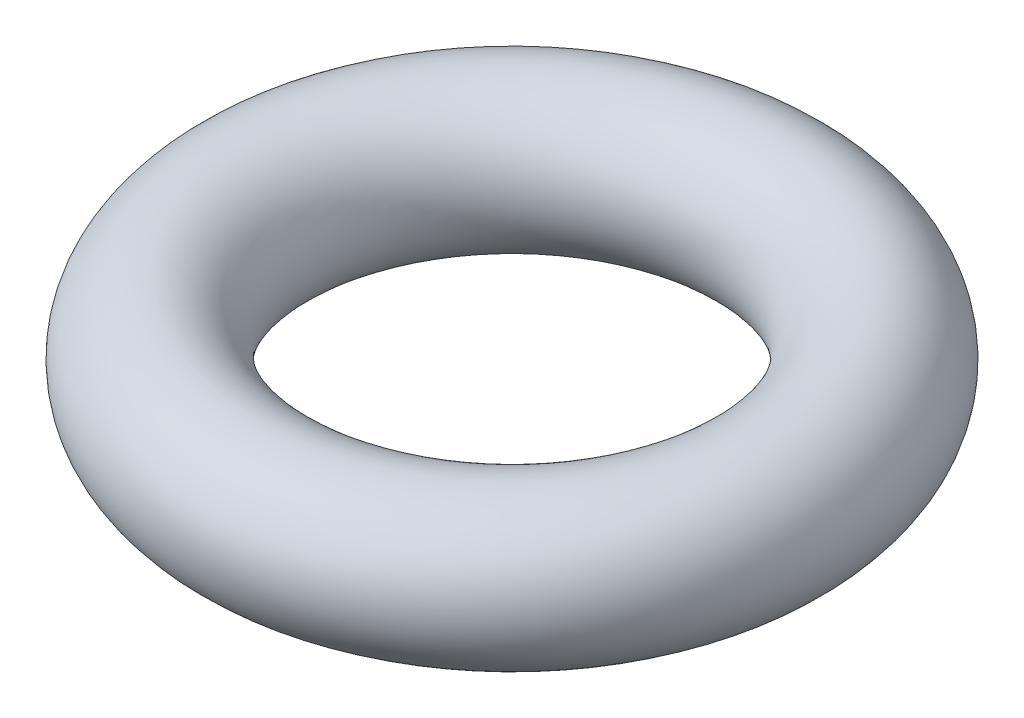
ISO-10303-21;
HEADER;
FILE_DESCRIPTION(('STEP AP214'),'2;1');
FILE_NAME('part.step','',(''),(''),'','','');
FILE_SCHEMA(('AUTOMOTIVE_DESIGN { 1 0 10303 214 1 1 1 1 }'));
ENDSEC;
DATA;
#1=APPLICATION_CONTEXT('core data for automotive mechanical design processes');
#2=APPLICATION_PROTOCOL_DEFINITION('international standard','automotive_design',2000,#1);
#3=PRODUCT_CONTEXT('',#1,'mechanical');
#4=PRODUCT('Part','Part','',(#3));
#5=PRODUCT_RELATED_PRODUCT_CATEGORY('part','',(#4));
#6=PRODUCT_DEFINITION_FORMATION('','',#4);
#7=PRODUCT_DEFINITION_CONTEXT('part definition',#1,'design');
#8=PRODUCT_DEFINITION('design','',#6,#7);
#9=PRODUCT_DEFINITION_SHAPE('','',#8);
#10=(LENGTH_UNIT() NAMED_UNIT(*) SI_UNIT(.MILLI.,.METRE.));
#11=(NAMED_UNIT(*) PLANE_ANGLE_UNIT() SI_UNIT($,.RADIAN.));
#12=(NAMED_UNIT(*) SI_UNIT($,.STERADIAN.) SOLID_ANGLE_UNIT());
#13=UNCERTAINTY_MEASURE_WITH_UNIT(LENGTH_MEASURE(1.E-05),#10,'distance_accuracy_value','');
#14=(GEOMETRIC_REPRESENTATION_CONTEXT(3) GLOBAL_UNCERTAINTY_ASSIGNED_CONTEXT((#13)) GLOBAL_UNIT_ASSIGNED_CONTEXT((#10,
#11,#12)) REPRESENTATION_CONTEXT('',''));
#15=CARTESIAN_POINT('',(0.,0.,0.));
#16=DIRECTION('',(0.,0.,1.));
#17=DIRECTION('',(1.,0.,0.));
#18=AXIS2_PLACEMENT_3D('',#15,#16,#17);
#19=CARTESIAN_POINT('',(0.,0.,0.));
#20=DIRECTION('',(0.,1.,0.));
#21=DIRECTION('',(0.,0.,1.));
#22=AXIS2_PLACEMENT_3D('',#19,#20,#21);
#23=TOROIDAL_SURFACE('',#22,3.49106419048439,1.);
#24=CARTESIAN_POINT('',(0.,0.,3.49106419048439));
#25=DIRECTION('',(1.,0.,0.));
#26=DIRECTION('',(0.,0.,-1.));
#27=AXIS2_PLACEMENT_3D('',#24,#25,#26);
#28=CIRCLE('',#27,1.);
#29=CARTESIAN_POINT('',(0.,0.,4.49106419048439));
#30=VERTEX_POINT('',#29);
#31=EDGE_CURVE('E10',#30,#30,#28,.T.);
#32=CARTESIAN_POINT('',(0.,0.,0.));
#33=DIRECTION('',(0.,1.,0.));
#34=DIRECTION('',(0.,0.,1.));
#35=AXIS2_PLACEMENT_3D('',#32,#33,#34);
#36=CIRCLE('',#35,4.49106419048439);
#37=EDGE_CURVE('',#30,#30,#36,.T.);
#38=ORIENTED_EDGE('',*,*,#31,.T.);
#39=ORIENTED_EDGE('',*,*,#31,.F.);
#40=ORIENTED_EDGE('',*,*,#37,.T.);
#41=ORIENTED_EDGE('',*,*,#37,.F.);
#42=EDGE_LOOP('',(#38,#40,#39,#41));
#43=FACE_BOUND('',#42,.T.);
#44=ADVANCED_FACE('F31',(#43),#23,.T.);
#45=CLOSED_SHELL('',(#44));
#46=MANIFOLD_SOLID_BREP('B2',#45);
#47=ADVANCED_BREP_SHAPE_REPRESENTATION('',(#18,#46),#14);
#48=SHAPE_DEFINITION_REPRESENTATION(#9,#47);
ENDSEC;
END-ISO-10303-21;
